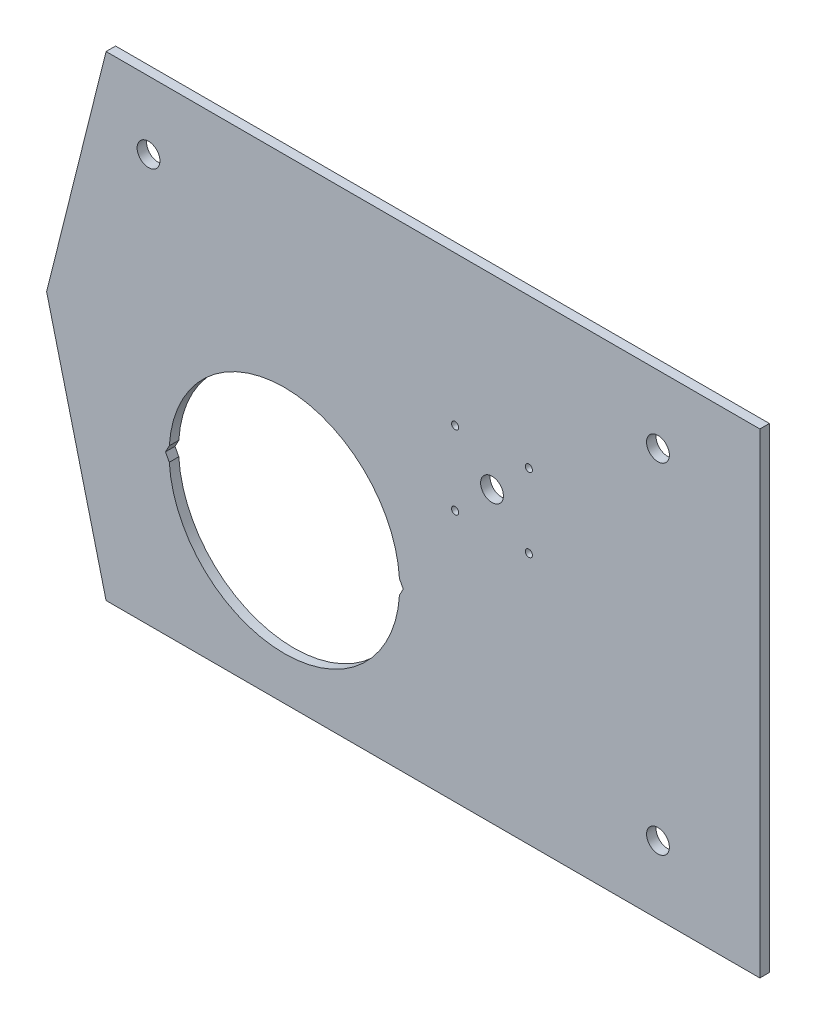
ISO-10303-21;
HEADER;
FILE_DESCRIPTION(('STEP AP214'),'2;1');
FILE_NAME('part.step','',(''),(''),'','','');
FILE_SCHEMA(('AUTOMOTIVE_DESIGN { 1 0 10303 214 1 1 1 1 }'));
ENDSEC;
DATA;
#1=APPLICATION_CONTEXT('core data for automotive mechanical design processes');
#2=APPLICATION_PROTOCOL_DEFINITION('international standard','automotive_design',2000,#1);
#3=PRODUCT_CONTEXT('',#1,'mechanical');
#4=PRODUCT('Part','Part','',(#3));
#5=PRODUCT_RELATED_PRODUCT_CATEGORY('part','',(#4));
#6=PRODUCT_DEFINITION_FORMATION('','',#4);
#7=PRODUCT_DEFINITION_CONTEXT('part definition',#1,'design');
#8=PRODUCT_DEFINITION('design','',#6,#7);
#9=PRODUCT_DEFINITION_SHAPE('','',#8);
#10=(LENGTH_UNIT() NAMED_UNIT(*) SI_UNIT(.MILLI.,.METRE.));
#11=(NAMED_UNIT(*) PLANE_ANGLE_UNIT() SI_UNIT($,.RADIAN.));
#12=(NAMED_UNIT(*) SI_UNIT($,.STERADIAN.) SOLID_ANGLE_UNIT());
#13=UNCERTAINTY_MEASURE_WITH_UNIT(LENGTH_MEASURE(1.E-05),#10,'distance_accuracy_value','');
#14=(GEOMETRIC_REPRESENTATION_CONTEXT(3) GLOBAL_UNCERTAINTY_ASSIGNED_CONTEXT((#13)) GLOBAL_UNIT_ASSIGNED_CONTEXT((#10,
#11,#12)) REPRESENTATION_CONTEXT('',''));
#15=CARTESIAN_POINT('',(0.,0.,0.));
#16=DIRECTION('',(0.,0.,1.));
#17=DIRECTION('',(1.,0.,0.));
#18=AXIS2_PLACEMENT_3D('',#15,#16,#17);
#19=CARTESIAN_POINT('',(-141.176470588235,35.2941176470588,4.));
#20=DIRECTION('',(-0.970142500145332,0.242535625036333,0.));
#21=DIRECTION('',(-0.242535625036333,-0.970142500145332,0.));
#22=AXIS2_PLACEMENT_3D('',#19,#20,#21);
#23=PLANE('',#22);
#24=DIRECTION('',(0.242535625036333,0.970142500145332,0.));
#25=VECTOR('',#24,1.);
#26=CARTESIAN_POINT('',(-141.176470588235,35.2941176470588,0.));
#27=LINE('',#26,#25);
#28=CARTESIAN_POINT('',(-150.,0.,0.));
#29=VERTEX_POINT('',#28);
#30=CARTESIAN_POINT('',(-125.,99.9999999999999,0.));
#31=VERTEX_POINT('',#30);
#32=EDGE_CURVE('E198',#29,#31,#27,.T.);
#33=ORIENTED_EDGE('',*,*,#32,.F.);
#34=DIRECTION('',(0.,0.,-1.));
#35=VECTOR('',#34,1.);
#36=CARTESIAN_POINT('',(-150.,0.,4.));
#37=LINE('',#36,#35);
#38=CARTESIAN_POINT('',(-150.,0.,4.));
#39=VERTEX_POINT('',#38);
#40=EDGE_CURVE('E11',#39,#29,#37,.T.);
#41=ORIENTED_EDGE('',*,*,#40,.F.);
#42=DIRECTION('',(0.242535625036333,0.970142500145332,0.));
#43=VECTOR('',#42,1.);
#44=CARTESIAN_POINT('',(-141.176470588235,35.2941176470588,4.));
#45=LINE('',#44,#43);
#46=CARTESIAN_POINT('',(-125.,99.9999999999999,4.));
#47=VERTEX_POINT('',#46);
#48=EDGE_CURVE('E151',#39,#47,#45,.T.);
#49=ORIENTED_EDGE('',*,*,#48,.T.);
#50=DIRECTION('',(0.,0.,-1.));
#51=VECTOR('',#50,1.);
#52=CARTESIAN_POINT('',(-125.,99.9999999999999,4.));
#53=LINE('',#52,#51);
#54=EDGE_CURVE('E99',#47,#31,#53,.T.);
#55=ORIENTED_EDGE('',*,*,#54,.T.);
#56=EDGE_LOOP('',(#33,#41,#49,#55));
#57=FACE_BOUND('',#56,.T.);
#58=ADVANCED_FACE('F36',(#57),#23,.T.);
#59=CARTESIAN_POINT('',(-141.176470588235,-35.2941176470588,4.));
#60=DIRECTION('',(-0.970142500145332,-0.242535625036333,0.));
#61=DIRECTION('',(0.242535625036333,-0.970142500145332,0.));
#62=AXIS2_PLACEMENT_3D('',#59,#60,#61);
#63=PLANE('',#62);
#64=DIRECTION('',(-0.242535625036333,0.970142500145332,0.));
#65=VECTOR('',#64,1.);
#66=CARTESIAN_POINT('',(-141.176470588235,-35.2941176470588,0.));
#67=LINE('',#66,#65);
#68=CARTESIAN_POINT('',(-125.,-100.,0.));
#69=VERTEX_POINT('',#68);
#70=EDGE_CURVE('E200',#69,#29,#67,.T.);
#71=ORIENTED_EDGE('',*,*,#70,.F.);
#72=DIRECTION('',(0.,0.,-1.));
#73=VECTOR('',#72,1.);
#74=CARTESIAN_POINT('',(-125.,-100.,4.));
#75=LINE('',#74,#73);
#76=CARTESIAN_POINT('',(-125.,-100.,4.));
#77=VERTEX_POINT('',#76);
#78=EDGE_CURVE('E46',#77,#69,#75,.T.);
#79=ORIENTED_EDGE('',*,*,#78,.F.);
#80=DIRECTION('',(-0.242535625036333,0.970142500145332,0.));
#81=VECTOR('',#80,1.);
#82=CARTESIAN_POINT('',(-141.176470588235,-35.2941176470588,4.));
#83=LINE('',#82,#81);
#84=EDGE_CURVE('E149',#77,#39,#83,.T.);
#85=ORIENTED_EDGE('',*,*,#84,.T.);
#86=ORIENTED_EDGE('',*,*,#40,.T.);
#87=EDGE_LOOP('',(#71,#79,#85,#86));
#88=FACE_BOUND('',#87,.T.);
#89=ADVANCED_FACE('F259',(#88),#63,.T.);
#90=CARTESIAN_POINT('',(0.,-100.,4.));
#91=DIRECTION('',(0.,-1.,0.));
#92=DIRECTION('',(1.,0.,0.));
#93=AXIS2_PLACEMENT_3D('',#90,#91,#92);
#94=PLANE('',#93);
#95=DIRECTION('',(-1.,0.,0.));
#96=VECTOR('',#95,1.);
#97=CARTESIAN_POINT('',(0.,-100.,0.));
#98=LINE('',#97,#96);
#99=CARTESIAN_POINT('',(150.,-99.9999999999999,0.));
#100=VERTEX_POINT('',#99);
#101=EDGE_CURVE('E137',#100,#69,#98,.T.);
#102=ORIENTED_EDGE('',*,*,#101,.F.);
#103=DIRECTION('',(0.,0.,-1.));
#104=VECTOR('',#103,1.);
#105=CARTESIAN_POINT('',(150.,-99.9999999999999,4.));
#106=LINE('',#105,#104);
#107=CARTESIAN_POINT('',(150.,-99.9999999999999,4.));
#108=VERTEX_POINT('',#107);
#109=EDGE_CURVE('E131',#108,#100,#106,.T.);
#110=ORIENTED_EDGE('',*,*,#109,.F.);
#111=DIRECTION('',(-1.,0.,0.));
#112=VECTOR('',#111,1.);
#113=CARTESIAN_POINT('',(0.,-100.,4.));
#114=LINE('',#113,#112);
#115=EDGE_CURVE('E135',#108,#77,#114,.T.);
#116=ORIENTED_EDGE('',*,*,#115,.T.);
#117=ORIENTED_EDGE('',*,*,#78,.T.);
#118=EDGE_LOOP('',(#102,#110,#116,#117));
#119=FACE_BOUND('',#118,.T.);
#120=ADVANCED_FACE('F133',(#119),#94,.T.);
#121=CARTESIAN_POINT('',(150.,0.,4.));
#122=DIRECTION('',(-1.,0.,0.));
#123=DIRECTION('',(0.,-1.,0.));
#124=AXIS2_PLACEMENT_3D('',#121,#122,#123);
#125=PLANE('',#124);
#126=DIRECTION('',(0.,1.,0.));
#127=VECTOR('',#126,1.);
#128=CARTESIAN_POINT('',(150.,0.,0.));
#129=LINE('',#128,#127);
#130=CARTESIAN_POINT('',(150.,100.,0.));
#131=VERTEX_POINT('',#130);
#132=EDGE_CURVE('E204',#100,#131,#129,.T.);
#133=ORIENTED_EDGE('',*,*,#132,.T.);
#134=DIRECTION('',(0.,0.,-1.));
#135=VECTOR('',#134,1.);
#136=CARTESIAN_POINT('',(150.,100.,4.));
#137=LINE('',#136,#135);
#138=CARTESIAN_POINT('',(150.,100.,4.));
#139=VERTEX_POINT('',#138);
#140=EDGE_CURVE('E140',#139,#131,#137,.T.);
#141=ORIENTED_EDGE('',*,*,#140,.F.);
#142=DIRECTION('',(0.,1.,0.));
#143=VECTOR('',#142,1.);
#144=CARTESIAN_POINT('',(150.,0.,4.));
#145=LINE('',#144,#143);
#146=EDGE_CURVE('E143',#108,#139,#145,.T.);
#147=ORIENTED_EDGE('',*,*,#146,.F.);
#148=ORIENTED_EDGE('',*,*,#109,.T.);
#149=EDGE_LOOP('',(#133,#141,#147,#148));
#150=FACE_BOUND('',#149,.T.);
#151=ADVANCED_FACE('F144',(#150),#125,.F.);
#152=CARTESIAN_POINT('',(-50.,-33.3333333333334,4.));
#153=DIRECTION('',(0.,0.,-1.));
#154=DIRECTION('',(-1.,0.,0.));
#155=AXIS2_PLACEMENT_3D('',#152,#153,#154);
#156=CYLINDRICAL_SURFACE('',#155,48.5);
#157=CARTESIAN_POINT('',(-50.,-33.3333333333334,0.));
#158=DIRECTION('',(0.,0.,1.));
#159=DIRECTION('',(1.,0.,0.));
#160=AXIS2_PLACEMENT_3D('',#157,#158,#159);
#161=CIRCLE('',#160,48.5);
#162=CARTESIAN_POINT('',(-98.4071275743562,-36.3333333333334,0.));
#163=VERTEX_POINT('',#162);
#164=CARTESIAN_POINT('',(-1.59287242564376,-36.3333333333334,0.));
#165=VERTEX_POINT('',#164);
#166=EDGE_CURVE('E157',#163,#165,#161,.T.);
#167=ORIENTED_EDGE('',*,*,#166,.F.);
#168=DIRECTION('',(0.,0.,-1.));
#169=VECTOR('',#168,1.);
#170=CARTESIAN_POINT('',(-98.4071275743562,-36.3333333333334,4.));
#171=LINE('',#170,#169);
#172=CARTESIAN_POINT('',(-98.4071275743562,-36.3333333333334,4.));
#173=VERTEX_POINT('',#172);
#174=EDGE_CURVE('E40',#173,#163,#171,.T.);
#175=ORIENTED_EDGE('',*,*,#174,.F.);
#176=CARTESIAN_POINT('',(-50.,-33.3333333333334,4.));
#177=DIRECTION('',(0.,0.,1.));
#178=DIRECTION('',(1.,0.,0.));
#179=AXIS2_PLACEMENT_3D('',#176,#177,#178);
#180=CIRCLE('',#179,48.5);
#181=CARTESIAN_POINT('',(-1.59287242564376,-36.3333333333334,4.));
#182=VERTEX_POINT('',#181);
#183=EDGE_CURVE('E207',#173,#182,#180,.T.);
#184=ORIENTED_EDGE('',*,*,#183,.T.);
#185=DIRECTION('',(0.,0.,-1.));
#186=VECTOR('',#185,1.);
#187=CARTESIAN_POINT('',(-1.59287242564376,-36.3333333333334,4.));
#188=LINE('',#187,#186);
#189=EDGE_CURVE('E156',#182,#165,#188,.T.);
#190=ORIENTED_EDGE('',*,*,#189,.T.);
#191=EDGE_LOOP('',(#167,#175,#184,#190));
#192=FACE_BOUND('',#191,.T.);
#193=ADVANCED_FACE('F38',(#192),#156,.F.);
#194=CARTESIAN_POINT('',(-91.8145940551823,-48.749645047392,4.));
#195=DIRECTION('',(-0.883222741642483,-0.4689537169546,0.));
#196=DIRECTION('',(0.4689537169546,-0.883222741642483,0.));
#197=AXIS2_PLACEMENT_3D('',#194,#195,#196);
#198=PLANE('',#197);
#199=DIRECTION('',(-0.4689537169546,0.883222741642483,0.));
#200=VECTOR('',#199,1.);
#201=CARTESIAN_POINT('',(-91.8145940551823,-48.749645047392,0.));
#202=LINE('',#201,#200);
#203=CARTESIAN_POINT('',(-100.,-33.3333333333334,0.));
#204=VERTEX_POINT('',#203);
#205=EDGE_CURVE('E160',#163,#204,#202,.T.);
#206=ORIENTED_EDGE('',*,*,#205,.T.);
#207=DIRECTION('',(0.,0.,-1.));
#208=VECTOR('',#207,1.);
#209=CARTESIAN_POINT('',(-100.,-33.3333333333334,4.));
#210=LINE('',#209,#208);
#211=CARTESIAN_POINT('',(-100.,-33.3333333333334,4.));
#212=VERTEX_POINT('',#211);
#213=EDGE_CURVE('E217',#212,#204,#210,.T.);
#214=ORIENTED_EDGE('',*,*,#213,.F.);
#215=DIRECTION('',(-0.4689537169546,0.883222741642483,0.));
#216=VECTOR('',#215,1.);
#217=CARTESIAN_POINT('',(-91.8145940551823,-48.749645047392,4.));
#218=LINE('',#217,#216);
#219=EDGE_CURVE('E226',#173,#212,#218,.T.);
#220=ORIENTED_EDGE('',*,*,#219,.F.);
#221=ORIENTED_EDGE('',*,*,#174,.T.);
#222=EDGE_LOOP('',(#206,#214,#220,#221));
#223=FACE_BOUND('',#222,.T.);
#224=ADVANCED_FACE('F225',(#223),#198,.F.);
#225=CARTESIAN_POINT('',(-64.2018882157109,34.0884724710229,4.));
#226=DIRECTION('',(-0.883222741642484,0.468953716954598,0.));
#227=DIRECTION('',(-0.468953716954598,-0.883222741642484,0.));
#228=AXIS2_PLACEMENT_3D('',#225,#226,#227);
#229=PLANE('',#228);
#230=DIRECTION('',(0.468953716954598,0.883222741642484,0.));
#231=VECTOR('',#230,1.);
#232=CARTESIAN_POINT('',(-64.2018882157109,34.0884724710229,0.));
#233=LINE('',#232,#231);
#234=CARTESIAN_POINT('',(-98.4071275743562,-30.3333333333334,0.));
#235=VERTEX_POINT('',#234);
#236=EDGE_CURVE('E162',#204,#235,#233,.T.);
#237=ORIENTED_EDGE('',*,*,#236,.T.);
#238=DIRECTION('',(0.,0.,-1.));
#239=VECTOR('',#238,1.);
#240=CARTESIAN_POINT('',(-98.4071275743562,-30.3333333333334,4.));
#241=LINE('',#240,#239);
#242=CARTESIAN_POINT('',(-98.4071275743562,-30.3333333333334,4.));
#243=VERTEX_POINT('',#242);
#244=EDGE_CURVE('E216',#243,#235,#241,.T.);
#245=ORIENTED_EDGE('',*,*,#244,.F.);
#246=DIRECTION('',(0.468953716954598,0.883222741642484,0.));
#247=VECTOR('',#246,1.);
#248=CARTESIAN_POINT('',(-64.2018882157109,34.0884724710229,4.));
#249=LINE('',#248,#247);
#250=EDGE_CURVE('E482',#212,#243,#249,.T.);
#251=ORIENTED_EDGE('',*,*,#250,.F.);
#252=ORIENTED_EDGE('',*,*,#213,.T.);
#253=EDGE_LOOP('',(#237,#245,#251,#252));
#254=FACE_BOUND('',#253,.T.);
#255=ADVANCED_FACE('F250',(#254),#229,.F.);
#256=CARTESIAN_POINT('',(-50.,-33.3333333333334,4.));
#257=DIRECTION('',(0.,0.,-1.));
#258=DIRECTION('',(-1.,0.,0.));
#259=AXIS2_PLACEMENT_3D('',#256,#257,#258);
#260=CYLINDRICAL_SURFACE('',#259,48.5);
#261=CARTESIAN_POINT('',(-50.,-33.3333333333334,0.));
#262=DIRECTION('',(0.,0.,1.));
#263=DIRECTION('',(1.,0.,0.));
#264=AXIS2_PLACEMENT_3D('',#261,#262,#263);
#265=CIRCLE('',#264,48.5);
#266=CARTESIAN_POINT('',(-1.59287242564375,-30.3333333333334,0.));
#267=VERTEX_POINT('',#266);
#268=EDGE_CURVE('E165',#267,#235,#265,.T.);
#269=ORIENTED_EDGE('',*,*,#268,.F.);
#270=DIRECTION('',(0.,0.,-1.));
#271=VECTOR('',#270,1.);
#272=CARTESIAN_POINT('',(-1.59287242564375,-30.3333333333334,4.));
#273=LINE('',#272,#271);
#274=CARTESIAN_POINT('',(-1.59287242564375,-30.3333333333334,4.));
#275=VERTEX_POINT('',#274);
#276=EDGE_CURVE('E214',#275,#267,#273,.T.);
#277=ORIENTED_EDGE('',*,*,#276,.F.);
#278=CARTESIAN_POINT('',(-50.,-33.3333333333334,4.));
#279=DIRECTION('',(0.,0.,1.));
#280=DIRECTION('',(1.,0.,0.));
#281=AXIS2_PLACEMENT_3D('',#278,#279,#280);
#282=CIRCLE('',#281,48.5);
#283=EDGE_CURVE('E249',#275,#243,#282,.T.);
#284=ORIENTED_EDGE('',*,*,#283,.T.);
#285=ORIENTED_EDGE('',*,*,#244,.T.);
#286=EDGE_LOOP('',(#269,#277,#284,#285));
#287=FACE_BOUND('',#286,.T.);
#288=ADVANCED_FACE('F247',(#287),#260,.F.);
#289=CARTESIAN_POINT('',(-13.8063529197358,-7.33058628818445,4.));
#290=DIRECTION('',(-0.883222741642484,-0.468953716954598,0.));
#291=DIRECTION('',(0.468953716954598,-0.883222741642484,0.));
#292=AXIS2_PLACEMENT_3D('',#289,#290,#291);
#293=PLANE('',#292);
#294=DIRECTION('',(-0.468953716954598,0.883222741642484,0.));
#295=VECTOR('',#294,1.);
#296=CARTESIAN_POINT('',(-13.8063529197358,-7.33058628818445,0.));
#297=LINE('',#296,#295);
#298=CARTESIAN_POINT('',(0.,-33.3333333333334,0.));
#299=VERTEX_POINT('',#298);
#300=EDGE_CURVE('E168',#299,#267,#297,.T.);
#301=ORIENTED_EDGE('',*,*,#300,.F.);
#302=DIRECTION('',(0.,0.,-1.));
#303=VECTOR('',#302,1.);
#304=CARTESIAN_POINT('',(0.,-33.3333333333334,4.));
#305=LINE('',#304,#303);
#306=CARTESIAN_POINT('',(0.,-33.3333333333334,4.));
#307=VERTEX_POINT('',#306);
#308=EDGE_CURVE('E212',#307,#299,#305,.T.);
#309=ORIENTED_EDGE('',*,*,#308,.F.);
#310=DIRECTION('',(-0.468953716954598,0.883222741642484,0.));
#311=VECTOR('',#310,1.);
#312=CARTESIAN_POINT('',(-13.8063529197358,-7.33058628818445,4.));
#313=LINE('',#312,#311);
#314=EDGE_CURVE('E243',#307,#275,#313,.T.);
#315=ORIENTED_EDGE('',*,*,#314,.T.);
#316=ORIENTED_EDGE('',*,*,#276,.T.);
#317=EDGE_LOOP('',(#301,#309,#315,#316));
#318=FACE_BOUND('',#317,.T.);
#319=ADVANCED_FACE('F240',(#318),#293,.T.);
#320=CARTESIAN_POINT('',(21.832408691632,37.1520265063954,4.));
#321=DIRECTION('',(0.,0.,-1.));
#322=DIRECTION('',(-1.,0.,0.));
#323=AXIS2_PLACEMENT_3D('',#320,#321,#322);
#324=CYLINDRICAL_SURFACE('',#323,1.5);
#325=CARTESIAN_POINT('',(21.832408691632,37.1520265063954,4.));
#326=DIRECTION('',(0.,0.,1.));
#327=DIRECTION('',(1.,0.,0.));
#328=AXIS2_PLACEMENT_3D('',#325,#326,#327);
#329=CIRCLE('',#328,1.5);
#330=CARTESIAN_POINT('',(23.332408691632,37.1520265063954,4.));
#331=VERTEX_POINT('',#330);
#332=EDGE_CURVE('E469',#331,#331,#329,.T.);
#333=ORIENTED_EDGE('',*,*,#332,.T.);
#334=EDGE_LOOP('',(#333));
#335=FACE_BOUND('',#334,.T.);
#336=CARTESIAN_POINT('',(21.832408691632,37.1520265063954,0.));
#337=DIRECTION('',(0.,0.,1.));
#338=DIRECTION('',(1.,0.,0.));
#339=AXIS2_PLACEMENT_3D('',#336,#337,#338);
#340=CIRCLE('',#339,1.5);
#341=CARTESIAN_POINT('',(23.332408691632,37.1520265063954,0.));
#342=VERTEX_POINT('',#341);
#343=EDGE_CURVE('E195',#342,#342,#340,.T.);
#344=ORIENTED_EDGE('',*,*,#343,.F.);
#345=EDGE_LOOP('',(#344));
#346=FACE_BOUND('',#345,.T.);
#347=ADVANCED_FACE('F268',(#335,#346),#324,.F.);
#348=CARTESIAN_POINT('',(52.832408691632,37.1520265063954,4.));
#349=DIRECTION('',(0.,0.,-1.));
#350=DIRECTION('',(-1.,0.,0.));
#351=AXIS2_PLACEMENT_3D('',#348,#349,#350);
#352=CYLINDRICAL_SURFACE('',#351,1.50000000000003);
#353=CARTESIAN_POINT('',(52.832408691632,37.1520265063954,4.));
#354=DIRECTION('',(0.,0.,1.));
#355=DIRECTION('',(1.,0.,0.));
#356=AXIS2_PLACEMENT_3D('',#353,#354,#355);
#357=CIRCLE('',#356,1.50000000000003);
#358=CARTESIAN_POINT('',(54.332408691632,37.1520265063954,4.));
#359=VERTEX_POINT('',#358);
#360=EDGE_CURVE('E466',#359,#359,#357,.T.);
#361=ORIENTED_EDGE('',*,*,#360,.T.);
#362=EDGE_LOOP('',(#361));
#363=FACE_BOUND('',#362,.T.);
#364=CARTESIAN_POINT('',(52.832408691632,37.1520265063954,0.));
#365=DIRECTION('',(0.,0.,1.));
#366=DIRECTION('',(1.,0.,0.));
#367=AXIS2_PLACEMENT_3D('',#364,#365,#366);
#368=CIRCLE('',#367,1.50000000000003);
#369=CARTESIAN_POINT('',(54.332408691632,37.1520265063954,0.));
#370=VERTEX_POINT('',#369);
#371=EDGE_CURVE('E192',#370,#370,#368,.T.);
#372=ORIENTED_EDGE('',*,*,#371,.F.);
#373=EDGE_LOOP('',(#372));
#374=FACE_BOUND('',#373,.T.);
#375=ADVANCED_FACE('F271',(#363,#374),#352,.F.);
#376=CARTESIAN_POINT('',(52.832408691632,6.15202650639541,4.));
#377=DIRECTION('',(0.,0.,-1.));
#378=DIRECTION('',(-1.,0.,0.));
#379=AXIS2_PLACEMENT_3D('',#376,#377,#378);
#380=CYLINDRICAL_SURFACE('',#379,1.50000000000003);
#381=CARTESIAN_POINT('',(52.832408691632,6.15202650639541,4.));
#382=DIRECTION('',(0.,0.,1.));
#383=DIRECTION('',(1.,0.,0.));
#384=AXIS2_PLACEMENT_3D('',#381,#382,#383);
#385=CIRCLE('',#384,1.50000000000003);
#386=CARTESIAN_POINT('',(54.332408691632,6.15202650639541,4.));
#387=VERTEX_POINT('',#386);
#388=EDGE_CURVE('E462',#387,#387,#385,.T.);
#389=ORIENTED_EDGE('',*,*,#388,.T.);
#390=EDGE_LOOP('',(#389));
#391=FACE_BOUND('',#390,.T.);
#392=CARTESIAN_POINT('',(52.832408691632,6.15202650639541,0.));
#393=DIRECTION('',(0.,0.,1.));
#394=DIRECTION('',(1.,0.,0.));
#395=AXIS2_PLACEMENT_3D('',#392,#393,#394);
#396=CIRCLE('',#395,1.50000000000003);
#397=CARTESIAN_POINT('',(54.332408691632,6.15202650639541,0.));
#398=VERTEX_POINT('',#397);
#399=EDGE_CURVE('E189',#398,#398,#396,.T.);
#400=ORIENTED_EDGE('',*,*,#399,.F.);
#401=EDGE_LOOP('',(#400));
#402=FACE_BOUND('',#401,.T.);
#403=ADVANCED_FACE('F275',(#391,#402),#380,.F.);
#404=CARTESIAN_POINT('',(21.832408691632,6.15202650639541,4.));
#405=DIRECTION('',(0.,0.,-1.));
#406=DIRECTION('',(-1.,0.,0.));
#407=AXIS2_PLACEMENT_3D('',#404,#405,#406);
#408=CYLINDRICAL_SURFACE('',#407,1.5);
#409=CARTESIAN_POINT('',(21.832408691632,6.15202650639541,4.));
#410=DIRECTION('',(0.,0.,1.));
#411=DIRECTION('',(1.,0.,0.));
#412=AXIS2_PLACEMENT_3D('',#409,#410,#411);
#413=CIRCLE('',#412,1.5);
#414=CARTESIAN_POINT('',(23.332408691632,6.15202650639541,4.));
#415=VERTEX_POINT('',#414);
#416=EDGE_CURVE('E458',#415,#415,#413,.T.);
#417=ORIENTED_EDGE('',*,*,#416,.T.);
#418=EDGE_LOOP('',(#417));
#419=FACE_BOUND('',#418,.T.);
#420=CARTESIAN_POINT('',(21.832408691632,6.15202650639541,0.));
#421=DIRECTION('',(0.,0.,1.));
#422=DIRECTION('',(1.,0.,0.));
#423=AXIS2_PLACEMENT_3D('',#420,#421,#422);
#424=CIRCLE('',#423,1.5);
#425=CARTESIAN_POINT('',(23.332408691632,6.15202650639541,0.));
#426=VERTEX_POINT('',#425);
#427=EDGE_CURVE('E186',#426,#426,#424,.T.);
#428=ORIENTED_EDGE('',*,*,#427,.F.);
#429=EDGE_LOOP('',(#428));
#430=FACE_BOUND('',#429,.T.);
#431=ADVANCED_FACE('F279',(#419,#430),#408,.F.);
#432=CARTESIAN_POINT('',(107.142857142857,71.4285714285714,4.));
#433=DIRECTION('',(0.,0.,-1.));
#434=DIRECTION('',(-1.,0.,0.));
#435=AXIS2_PLACEMENT_3D('',#432,#433,#434);
#436=CYLINDRICAL_SURFACE('',#435,4.8);
#437=CARTESIAN_POINT('',(107.142857142857,71.4285714285714,4.));
#438=DIRECTION('',(0.,0.,1.));
#439=DIRECTION('',(1.,0.,0.));
#440=AXIS2_PLACEMENT_3D('',#437,#438,#439);
#441=CIRCLE('',#440,4.8);
#442=CARTESIAN_POINT('',(111.942857142857,71.4285714285714,4.));
#443=VERTEX_POINT('',#442);
#444=EDGE_CURVE('E454',#443,#443,#441,.T.);
#445=ORIENTED_EDGE('',*,*,#444,.T.);
#446=EDGE_LOOP('',(#445));
#447=FACE_BOUND('',#446,.T.);
#448=CARTESIAN_POINT('',(107.142857142857,71.4285714285714,0.));
#449=DIRECTION('',(0.,0.,1.));
#450=DIRECTION('',(1.,0.,0.));
#451=AXIS2_PLACEMENT_3D('',#448,#449,#450);
#452=CIRCLE('',#451,4.8);
#453=CARTESIAN_POINT('',(111.942857142857,71.4285714285714,0.));
#454=VERTEX_POINT('',#453);
#455=EDGE_CURVE('E183',#454,#454,#452,.T.);
#456=ORIENTED_EDGE('',*,*,#455,.F.);
#457=EDGE_LOOP('',(#456));
#458=FACE_BOUND('',#457,.T.);
#459=ADVANCED_FACE('F283',(#447,#458),#436,.F.);
#460=CARTESIAN_POINT('',(107.142857142857,-71.4285714285714,4.));
#461=DIRECTION('',(0.,0.,-1.));
#462=DIRECTION('',(-1.,0.,0.));
#463=AXIS2_PLACEMENT_3D('',#460,#461,#462);
#464=CYLINDRICAL_SURFACE('',#463,4.8);
#465=CARTESIAN_POINT('',(107.142857142857,-71.4285714285714,4.));
#466=DIRECTION('',(0.,0.,1.));
#467=DIRECTION('',(1.,0.,0.));
#468=AXIS2_PLACEMENT_3D('',#465,#466,#467);
#469=CIRCLE('',#468,4.8);
#470=CARTESIAN_POINT('',(111.942857142857,-71.4285714285714,4.));
#471=VERTEX_POINT('',#470);
#472=EDGE_CURVE('E450',#471,#471,#469,.T.);
#473=ORIENTED_EDGE('',*,*,#472,.T.);
#474=EDGE_LOOP('',(#473));
#475=FACE_BOUND('',#474,.T.);
#476=CARTESIAN_POINT('',(107.142857142857,-71.4285714285714,0.));
#477=DIRECTION('',(0.,0.,1.));
#478=DIRECTION('',(1.,0.,0.));
#479=AXIS2_PLACEMENT_3D('',#476,#477,#478);
#480=CIRCLE('',#479,4.8);
#481=CARTESIAN_POINT('',(111.942857142857,-71.4285714285714,0.));
#482=VERTEX_POINT('',#481);
#483=EDGE_CURVE('E180',#482,#482,#480,.T.);
#484=ORIENTED_EDGE('',*,*,#483,.F.);
#485=EDGE_LOOP('',(#484));
#486=FACE_BOUND('',#485,.T.);
#487=ADVANCED_FACE('F287',(#475,#486),#464,.F.);
#488=CARTESIAN_POINT('',(37.332408691632,21.6520265063954,4.));
#489=DIRECTION('',(0.,0.,-1.));
#490=DIRECTION('',(-1.,0.,0.));
#491=AXIS2_PLACEMENT_3D('',#488,#489,#490);
#492=CYLINDRICAL_SURFACE('',#491,4.8);
#493=CARTESIAN_POINT('',(37.332408691632,21.6520265063954,4.));
#494=DIRECTION('',(0.,0.,1.));
#495=DIRECTION('',(1.,0.,0.));
#496=AXIS2_PLACEMENT_3D('',#493,#494,#495);
#497=CIRCLE('',#496,4.8);
#498=CARTESIAN_POINT('',(42.132408691632,21.6520265063954,4.));
#499=VERTEX_POINT('',#498);
#500=EDGE_CURVE('E446',#499,#499,#497,.T.);
#501=ORIENTED_EDGE('',*,*,#500,.T.);
#502=EDGE_LOOP('',(#501));
#503=FACE_BOUND('',#502,.T.);
#504=CARTESIAN_POINT('',(37.332408691632,21.6520265063954,0.));
#505=DIRECTION('',(0.,0.,1.));
#506=DIRECTION('',(1.,0.,0.));
#507=AXIS2_PLACEMENT_3D('',#504,#505,#506);
#508=CIRCLE('',#507,4.8);
#509=CARTESIAN_POINT('',(42.132408691632,21.6520265063954,0.));
#510=VERTEX_POINT('',#509);
#511=EDGE_CURVE('E177',#510,#510,#508,.T.);
#512=ORIENTED_EDGE('',*,*,#511,.F.);
#513=EDGE_LOOP('',(#512));
#514=FACE_BOUND('',#513,.T.);
#515=ADVANCED_FACE('F291',(#503,#514),#492,.F.);
#516=CARTESIAN_POINT('',(-107.142857142857,71.4285714285713,4.));
#517=DIRECTION('',(0.,0.,-1.));
#518=DIRECTION('',(-1.,0.,0.));
#519=AXIS2_PLACEMENT_3D('',#516,#517,#518);
#520=CYLINDRICAL_SURFACE('',#519,4.8);
#521=CARTESIAN_POINT('',(-107.142857142857,71.4285714285713,4.));
#522=DIRECTION('',(0.,0.,1.));
#523=DIRECTION('',(1.,0.,0.));
#524=AXIS2_PLACEMENT_3D('',#521,#522,#523);
#525=CIRCLE('',#524,4.8);
#526=CARTESIAN_POINT('',(-102.342857142857,71.4285714285713,4.));
#527=VERTEX_POINT('',#526);
#528=EDGE_CURVE('E442',#527,#527,#525,.T.);
#529=ORIENTED_EDGE('',*,*,#528,.T.);
#530=EDGE_LOOP('',(#529));
#531=FACE_BOUND('',#530,.T.);
#532=CARTESIAN_POINT('',(-107.142857142857,71.4285714285713,0.));
#533=DIRECTION('',(0.,0.,1.));
#534=DIRECTION('',(1.,0.,0.));
#535=AXIS2_PLACEMENT_3D('',#532,#533,#534);
#536=CIRCLE('',#535,4.8);
#537=CARTESIAN_POINT('',(-102.342857142857,71.4285714285713,0.));
#538=VERTEX_POINT('',#537);
#539=EDGE_CURVE('E174',#538,#538,#536,.T.);
#540=ORIENTED_EDGE('',*,*,#539,.F.);
#541=EDGE_LOOP('',(#540));
#542=FACE_BOUND('',#541,.T.);
#543=ADVANCED_FACE('F295',(#531,#542),#520,.F.);
#544=CARTESIAN_POINT('',(13.8063529197359,-7.33058628818458,4.));
#545=DIRECTION('',(-0.883222741642482,0.468953716954602,0.));
#546=DIRECTION('',(-0.468953716954602,-0.883222741642482,0.));
#547=AXIS2_PLACEMENT_3D('',#544,#545,#546);
#548=PLANE('',#547);
#549=DIRECTION('',(0.468953716954602,0.883222741642482,0.));
#550=VECTOR('',#549,1.);
#551=CARTESIAN_POINT('',(13.8063529197359,-7.33058628818458,0.));
#552=LINE('',#551,#550);
#553=EDGE_CURVE('E171',#165,#299,#552,.T.);
#554=ORIENTED_EDGE('',*,*,#553,.F.);
#555=ORIENTED_EDGE('',*,*,#189,.F.);
#556=DIRECTION('',(0.468953716954602,0.883222741642482,0.));
#557=VECTOR('',#556,1.);
#558=CARTESIAN_POINT('',(13.8063529197359,-7.33058628818458,4.));
#559=LINE('',#558,#557);
#560=EDGE_CURVE('E236',#182,#307,#559,.T.);
#561=ORIENTED_EDGE('',*,*,#560,.T.);
#562=ORIENTED_EDGE('',*,*,#308,.T.);
#563=EDGE_LOOP('',(#554,#555,#561,#562));
#564=FACE_BOUND('',#563,.T.);
#565=ADVANCED_FACE('F235',(#564),#548,.T.);
#566=CARTESIAN_POINT('',(0.,100.,4.));
#567=DIRECTION('',(0.,-1.,0.));
#568=DIRECTION('',(1.,0.,0.));
#569=AXIS2_PLACEMENT_3D('',#566,#567,#568);
#570=PLANE('',#569);
#571=DIRECTION('',(-1.,0.,0.));
#572=VECTOR('',#571,1.);
#573=CARTESIAN_POINT('',(0.,100.,0.));
#574=LINE('',#573,#572);
#575=EDGE_CURVE('E92',#131,#31,#574,.T.);
#576=ORIENTED_EDGE('',*,*,#575,.T.);
#577=ORIENTED_EDGE('',*,*,#54,.F.);
#578=DIRECTION('',(-1.,0.,0.));
#579=VECTOR('',#578,1.);
#580=CARTESIAN_POINT('',(0.,100.,4.));
#581=LINE('',#580,#579);
#582=EDGE_CURVE('E55',#139,#47,#581,.T.);
#583=ORIENTED_EDGE('',*,*,#582,.F.);
#584=ORIENTED_EDGE('',*,*,#140,.T.);
#585=EDGE_LOOP('',(#576,#577,#583,#584));
#586=FACE_BOUND('',#585,.T.);
#587=ADVANCED_FACE('F302',(#586),#570,.F.);
#588=CARTESIAN_POINT('',(0.,0.,4.));
#589=DIRECTION('',(0.,0.,1.));
#590=DIRECTION('',(1.,0.,0.));
#591=AXIS2_PLACEMENT_3D('',#588,#589,#590);
#592=PLANE('',#591);
#593=ORIENTED_EDGE('',*,*,#183,.F.);
#594=ORIENTED_EDGE('',*,*,#219,.T.);
#595=ORIENTED_EDGE('',*,*,#250,.T.);
#596=ORIENTED_EDGE('',*,*,#283,.F.);
#597=ORIENTED_EDGE('',*,*,#314,.F.);
#598=ORIENTED_EDGE('',*,*,#560,.F.);
#599=EDGE_LOOP('',(#593,#594,#595,#596,#597,#598));
#600=FACE_BOUND('',#599,.T.);
#601=ORIENTED_EDGE('',*,*,#528,.F.);
#602=EDGE_LOOP('',(#601));
#603=FACE_BOUND('',#602,.T.);
#604=ORIENTED_EDGE('',*,*,#500,.F.);
#605=EDGE_LOOP('',(#604));
#606=FACE_BOUND('',#605,.T.);
#607=ORIENTED_EDGE('',*,*,#472,.F.);
#608=EDGE_LOOP('',(#607));
#609=FACE_BOUND('',#608,.T.);
#610=ORIENTED_EDGE('',*,*,#444,.F.);
#611=EDGE_LOOP('',(#610));
#612=FACE_BOUND('',#611,.T.);
#613=ORIENTED_EDGE('',*,*,#416,.F.);
#614=EDGE_LOOP('',(#613));
#615=FACE_BOUND('',#614,.T.);
#616=ORIENTED_EDGE('',*,*,#388,.F.);
#617=EDGE_LOOP('',(#616));
#618=FACE_BOUND('',#617,.T.);
#619=ORIENTED_EDGE('',*,*,#360,.F.);
#620=EDGE_LOOP('',(#619));
#621=FACE_BOUND('',#620,.T.);
#622=ORIENTED_EDGE('',*,*,#332,.F.);
#623=EDGE_LOOP('',(#622));
#624=FACE_BOUND('',#623,.T.);
#625=ORIENTED_EDGE('',*,*,#48,.F.);
#626=ORIENTED_EDGE('',*,*,#84,.F.);
#627=ORIENTED_EDGE('',*,*,#115,.F.);
#628=ORIENTED_EDGE('',*,*,#146,.T.);
#629=ORIENTED_EDGE('',*,*,#582,.T.);
#630=EDGE_LOOP('',(#625,#626,#627,#628,#629));
#631=FACE_BOUND('',#630,.T.);
#632=ADVANCED_FACE('F147',(#600,#603,#606,#609,#612,#615,#618,#621,#624,#631),#592,.T.);
#633=CARTESIAN_POINT('',(0.,0.,0.));
#634=DIRECTION('',(0.,0.,1.));
#635=DIRECTION('',(1.,0.,0.));
#636=AXIS2_PLACEMENT_3D('',#633,#634,#635);
#637=PLANE('',#636);
#638=ORIENTED_EDGE('',*,*,#166,.T.);
#639=ORIENTED_EDGE('',*,*,#553,.T.);
#640=ORIENTED_EDGE('',*,*,#300,.T.);
#641=ORIENTED_EDGE('',*,*,#268,.T.);
#642=ORIENTED_EDGE('',*,*,#236,.F.);
#643=ORIENTED_EDGE('',*,*,#205,.F.);
#644=EDGE_LOOP('',(#638,#639,#640,#641,#642,#643));
#645=FACE_BOUND('',#644,.T.);
#646=ORIENTED_EDGE('',*,*,#539,.T.);
#647=EDGE_LOOP('',(#646));
#648=FACE_BOUND('',#647,.T.);
#649=ORIENTED_EDGE('',*,*,#511,.T.);
#650=EDGE_LOOP('',(#649));
#651=FACE_BOUND('',#650,.T.);
#652=ORIENTED_EDGE('',*,*,#483,.T.);
#653=EDGE_LOOP('',(#652));
#654=FACE_BOUND('',#653,.T.);
#655=ORIENTED_EDGE('',*,*,#455,.T.);
#656=EDGE_LOOP('',(#655));
#657=FACE_BOUND('',#656,.T.);
#658=ORIENTED_EDGE('',*,*,#427,.T.);
#659=EDGE_LOOP('',(#658));
#660=FACE_BOUND('',#659,.T.);
#661=ORIENTED_EDGE('',*,*,#399,.T.);
#662=EDGE_LOOP('',(#661));
#663=FACE_BOUND('',#662,.T.);
#664=ORIENTED_EDGE('',*,*,#371,.T.);
#665=EDGE_LOOP('',(#664));
#666=FACE_BOUND('',#665,.T.);
#667=ORIENTED_EDGE('',*,*,#343,.T.);
#668=EDGE_LOOP('',(#667));
#669=FACE_BOUND('',#668,.T.);
#670=ORIENTED_EDGE('',*,*,#32,.T.);
#671=ORIENTED_EDGE('',*,*,#575,.F.);
#672=ORIENTED_EDGE('',*,*,#132,.F.);
#673=ORIENTED_EDGE('',*,*,#101,.T.);
#674=ORIENTED_EDGE('',*,*,#70,.T.);
#675=EDGE_LOOP('',(#670,#671,#672,#673,#674));
#676=FACE_BOUND('',#675,.T.);
#677=ADVANCED_FACE('F229',(#645,#648,#651,#654,#657,#660,#663,#666,#669,#676),#637,.F.);
#678=CLOSED_SHELL('',(#58,#89,#120,#151,#193,#224,#255,#288,#319,#347,#375,#403,#431,#459,#487,
#515,#543,#565,#587,#632,#677));
#679=MANIFOLD_SOLID_BREP('B2',#678);
#680=ADVANCED_BREP_SHAPE_REPRESENTATION('',(#18,#679),#14);
#681=SHAPE_DEFINITION_REPRESENTATION(#9,#680);
ENDSEC;
END-ISO-10303-21;
